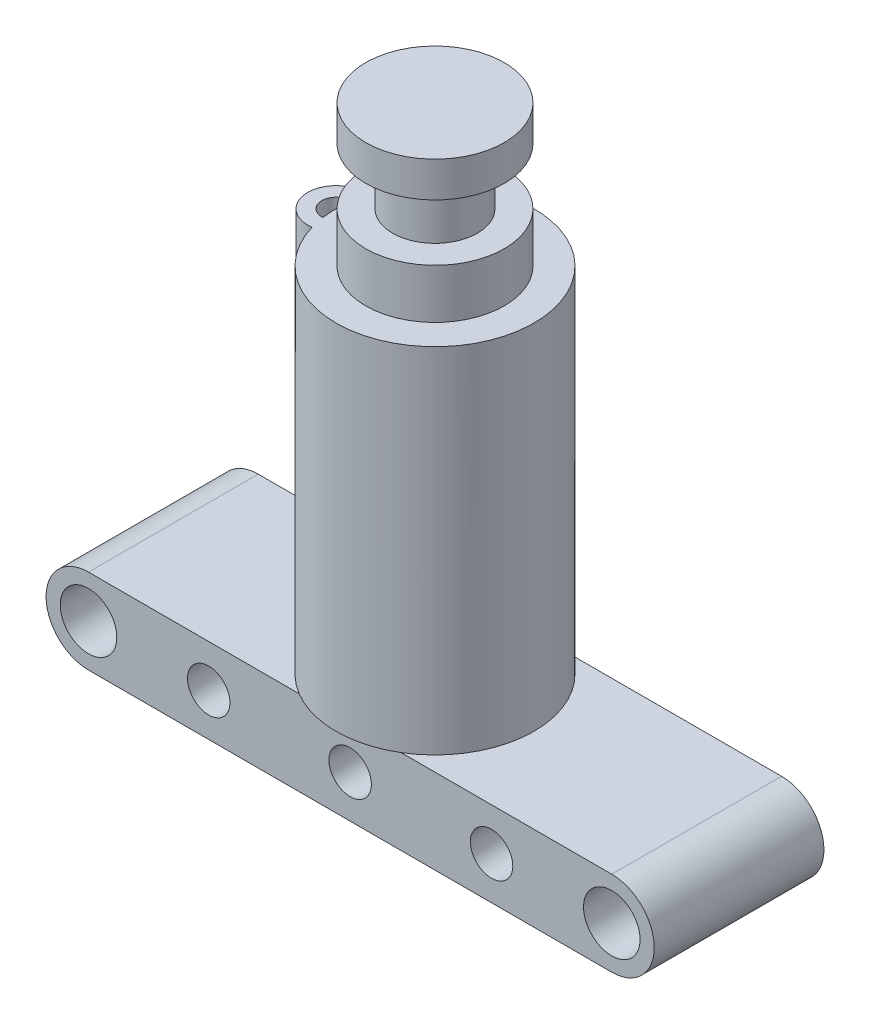
ISO-10303-21;
HEADER;
FILE_DESCRIPTION(('STEP AP214'),'2;1');
FILE_NAME('part.step','',(''),(''),'','','');
FILE_SCHEMA(('AUTOMOTIVE_DESIGN { 1 0 10303 214 1 1 1 1 }'));
ENDSEC;
DATA;
#1=APPLICATION_CONTEXT('core data for automotive mechanical design processes');
#2=APPLICATION_PROTOCOL_DEFINITION('international standard','automotive_design',2000,#1);
#3=PRODUCT_CONTEXT('',#1,'mechanical');
#4=PRODUCT('Part','Part','',(#3));
#5=PRODUCT_RELATED_PRODUCT_CATEGORY('part','',(#4));
#6=PRODUCT_DEFINITION_FORMATION('','',#4);
#7=PRODUCT_DEFINITION_CONTEXT('part definition',#1,'design');
#8=PRODUCT_DEFINITION('design','',#6,#7);
#9=PRODUCT_DEFINITION_SHAPE('','',#8);
#10=(LENGTH_UNIT() NAMED_UNIT(*) SI_UNIT(.MILLI.,.METRE.));
#11=(NAMED_UNIT(*) PLANE_ANGLE_UNIT() SI_UNIT($,.RADIAN.));
#12=(NAMED_UNIT(*) SI_UNIT($,.STERADIAN.) SOLID_ANGLE_UNIT());
#13=UNCERTAINTY_MEASURE_WITH_UNIT(LENGTH_MEASURE(1.E-05),#10,'distance_accuracy_value','');
#14=(GEOMETRIC_REPRESENTATION_CONTEXT(3) GLOBAL_UNCERTAINTY_ASSIGNED_CONTEXT((#13)) GLOBAL_UNIT_ASSIGNED_CONTEXT((#10,
#11,#12)) REPRESENTATION_CONTEXT('',''));
#15=CARTESIAN_POINT('',(0.,0.,0.));
#16=DIRECTION('',(0.,0.,1.));
#17=DIRECTION('',(1.,0.,0.));
#18=AXIS2_PLACEMENT_3D('',#15,#16,#17);
#19=CARTESIAN_POINT('',(18.5,38.,6.));
#20=DIRECTION('',(0.,-1.,0.));
#21=DIRECTION('',(0.,0.,-1.));
#22=AXIS2_PLACEMENT_3D('',#19,#20,#21);
#23=CYLINDRICAL_SURFACE('',#22,4.9);
#24=CARTESIAN_POINT('',(18.5,28.,6.));
#25=DIRECTION('',(0.,1.,0.));
#26=DIRECTION('',(0.,0.,1.));
#27=AXIS2_PLACEMENT_3D('',#24,#25,#26);
#28=CIRCLE('',#27,4.9);
#29=CARTESIAN_POINT('',(18.5,28.,10.9));
#30=VERTEX_POINT('',#29);
#31=EDGE_CURVE('E174',#30,#30,#28,.T.);
#32=ORIENTED_EDGE('',*,*,#31,.T.);
#33=EDGE_LOOP('',(#32));
#34=FACE_BOUND('',#33,.T.);
#35=CARTESIAN_POINT('',(18.5,31.5,6.));
#36=DIRECTION('',(0.,1.,0.));
#37=DIRECTION('',(0.,0.,1.));
#38=AXIS2_PLACEMENT_3D('',#35,#36,#37);
#39=CIRCLE('',#38,4.9);
#40=CARTESIAN_POINT('',(18.5,31.5,10.9));
#41=VERTEX_POINT('',#40);
#42=EDGE_CURVE('E385',#41,#41,#39,.T.);
#43=ORIENTED_EDGE('',*,*,#42,.F.);
#44=EDGE_LOOP('',(#43));
#45=FACE_BOUND('',#44,.T.);
#46=ADVANCED_FACE('F47',(#34,#45),#23,.T.);
#47=CARTESIAN_POINT('',(0.,3.,12.));
#48=DIRECTION('',(0.,-1.,0.));
#49=DIRECTION('',(0.,0.,-1.));
#50=AXIS2_PLACEMENT_3D('',#47,#48,#49);
#51=PLANE('',#50);
#52=CARTESIAN_POINT('',(18.5,3.,6.));
#53=DIRECTION('',(0.,-1.,0.));
#54=DIRECTION('',(0.,0.,-1.));
#55=AXIS2_PLACEMENT_3D('',#52,#53,#54);
#56=CIRCLE('',#55,7.);
#57=CARTESIAN_POINT('',(14.894448724536,3.,0.));
#58=VERTEX_POINT('',#57);
#59=CARTESIAN_POINT('',(14.894448724536,3.,12.));
#60=VERTEX_POINT('',#59);
#61=EDGE_CURVE('E319',#58,#60,#56,.F.);
#62=ORIENTED_EDGE('',*,*,#61,.F.);
#63=DIRECTION('',(-1.,0.,0.));
#64=VECTOR('',#63,1.);
#65=CARTESIAN_POINT('',(0.,3.,0.));
#66=LINE('',#65,#64);
#67=CARTESIAN_POINT('',(0.,3.,0.));
#68=VERTEX_POINT('',#67);
#69=EDGE_CURVE('E301',#58,#68,#66,.T.);
#70=ORIENTED_EDGE('',*,*,#69,.T.);
#71=DIRECTION('',(0.,0.,-1.));
#72=VECTOR('',#71,1.);
#73=CARTESIAN_POINT('',(0.,3.,12.));
#74=LINE('',#73,#72);
#75=CARTESIAN_POINT('',(0.,3.,12.));
#76=VERTEX_POINT('',#75);
#77=EDGE_CURVE('E290',#76,#68,#74,.T.);
#78=ORIENTED_EDGE('',*,*,#77,.F.);
#79=DIRECTION('',(-1.,0.,0.));
#80=VECTOR('',#79,1.);
#81=CARTESIAN_POINT('',(0.,3.,12.));
#82=LINE('',#81,#80);
#83=EDGE_CURVE('E285',#60,#76,#82,.T.);
#84=ORIENTED_EDGE('',*,*,#83,.F.);
#85=EDGE_LOOP('',(#62,#70,#78,#84));
#86=FACE_BOUND('',#85,.T.);
#87=ADVANCED_FACE('F355',(#86),#51,.F.);
#88=CARTESIAN_POINT('',(0.,0.,12.));
#89=DIRECTION('',(0.,0.,1.));
#90=DIRECTION('',(1.,0.,0.));
#91=AXIS2_PLACEMENT_3D('',#88,#89,#90);
#92=PLANE('',#91);
#93=CARTESIAN_POINT('',(8.5,0.,12.));
#94=DIRECTION('',(0.,0.,1.));
#95=DIRECTION('',(1.,0.,0.));
#96=AXIS2_PLACEMENT_3D('',#93,#94,#95);
#97=CIRCLE('',#96,1.5);
#98=CARTESIAN_POINT('',(10.,0.,12.));
#99=VERTEX_POINT('',#98);
#100=EDGE_CURVE('E237',#99,#99,#97,.T.);
#101=ORIENTED_EDGE('',*,*,#100,.F.);
#102=EDGE_LOOP('',(#101));
#103=FACE_BOUND('',#102,.T.);
#104=CARTESIAN_POINT('',(28.5,0.,12.));
#105=DIRECTION('',(0.,0.,1.));
#106=DIRECTION('',(1.,0.,0.));
#107=AXIS2_PLACEMENT_3D('',#104,#105,#106);
#108=CIRCLE('',#107,1.5);
#109=CARTESIAN_POINT('',(30.,0.,12.));
#110=VERTEX_POINT('',#109);
#111=EDGE_CURVE('E238',#110,#110,#108,.T.);
#112=ORIENTED_EDGE('',*,*,#111,.F.);
#113=EDGE_LOOP('',(#112));
#114=FACE_BOUND('',#113,.T.);
#115=CARTESIAN_POINT('',(18.5,0.,12.));
#116=DIRECTION('',(0.,0.,1.));
#117=DIRECTION('',(1.,0.,0.));
#118=AXIS2_PLACEMENT_3D('',#115,#116,#117);
#119=CIRCLE('',#118,1.5);
#120=CARTESIAN_POINT('',(20.,0.,12.));
#121=VERTEX_POINT('',#120);
#122=EDGE_CURVE('E242',#121,#121,#119,.T.);
#123=ORIENTED_EDGE('',*,*,#122,.F.);
#124=EDGE_LOOP('',(#123));
#125=FACE_BOUND('',#124,.T.);
#126=CARTESIAN_POINT('',(0.,0.,12.));
#127=DIRECTION('',(0.,0.,1.));
#128=DIRECTION('',(1.,0.,0.));
#129=AXIS2_PLACEMENT_3D('',#126,#127,#128);
#130=CIRCLE('',#129,2.);
#131=CARTESIAN_POINT('',(2.,0.,12.));
#132=VERTEX_POINT('',#131);
#133=EDGE_CURVE('E266',#132,#132,#130,.T.);
#134=ORIENTED_EDGE('',*,*,#133,.F.);
#135=EDGE_LOOP('',(#134));
#136=FACE_BOUND('',#135,.T.);
#137=CARTESIAN_POINT('',(0.,0.,12.));
#138=DIRECTION('',(0.,0.,1.));
#139=DIRECTION('',(1.,0.,0.));
#140=AXIS2_PLACEMENT_3D('',#137,#138,#139);
#141=CIRCLE('',#140,3.);
#142=CARTESIAN_POINT('',(0.,-3.,12.));
#143=VERTEX_POINT('',#142);
#144=EDGE_CURVE('E274',#76,#143,#141,.T.);
#145=ORIENTED_EDGE('',*,*,#144,.T.);
#146=DIRECTION('',(1.,0.,0.));
#147=VECTOR('',#146,1.);
#148=CARTESIAN_POINT('',(0.,-3.,12.));
#149=LINE('',#148,#147);
#150=CARTESIAN_POINT('',(37.,-3.,12.));
#151=VERTEX_POINT('',#150);
#152=EDGE_CURVE('E278',#143,#151,#149,.T.);
#153=ORIENTED_EDGE('',*,*,#152,.T.);
#154=CARTESIAN_POINT('',(37.,0.,12.));
#155=DIRECTION('',(0.,0.,1.));
#156=DIRECTION('',(1.,0.,0.));
#157=AXIS2_PLACEMENT_3D('',#154,#155,#156);
#158=CIRCLE('',#157,3.);
#159=CARTESIAN_POINT('',(37.,3.,12.));
#160=VERTEX_POINT('',#159);
#161=EDGE_CURVE('E282',#151,#160,#158,.T.);
#162=ORIENTED_EDGE('',*,*,#161,.T.);
#163=CARTESIAN_POINT('',(22.105551275464,3.,12.));
#164=VERTEX_POINT('',#163);
#165=EDGE_CURVE('E286',#160,#164,#82,.T.);
#166=ORIENTED_EDGE('',*,*,#165,.T.);
#167=EDGE_CURVE('E291',#164,#60,#82,.T.);
#168=ORIENTED_EDGE('',*,*,#167,.T.);
#169=ORIENTED_EDGE('',*,*,#83,.T.);
#170=EDGE_LOOP('',(#145,#153,#162,#166,#168,#169));
#171=FACE_BOUND('',#170,.T.);
#172=CARTESIAN_POINT('',(37.,0.,12.));
#173=DIRECTION('',(0.,0.,1.));
#174=DIRECTION('',(1.,0.,0.));
#175=AXIS2_PLACEMENT_3D('',#172,#173,#174);
#176=CIRCLE('',#175,2.);
#177=CARTESIAN_POINT('',(39.,0.,12.));
#178=VERTEX_POINT('',#177);
#179=EDGE_CURVE('E258',#178,#178,#176,.T.);
#180=ORIENTED_EDGE('',*,*,#179,.F.);
#181=EDGE_LOOP('',(#180));
#182=FACE_BOUND('',#181,.T.);
#183=ADVANCED_FACE('F362',(#103,#114,#125,#136,#171,#182),#92,.T.);
#184=CARTESIAN_POINT('',(0.,0.,0.));
#185=DIRECTION('',(0.,0.,1.));
#186=DIRECTION('',(1.,0.,0.));
#187=AXIS2_PLACEMENT_3D('',#184,#185,#186);
#188=PLANE('',#187);
#189=CARTESIAN_POINT('',(8.5,0.,0.));
#190=DIRECTION('',(0.,0.,1.));
#191=DIRECTION('',(1.,0.,0.));
#192=AXIS2_PLACEMENT_3D('',#189,#190,#191);
#193=CIRCLE('',#192,1.5);
#194=CARTESIAN_POINT('',(10.,0.,0.));
#195=VERTEX_POINT('',#194);
#196=EDGE_CURVE('E233',#195,#195,#193,.T.);
#197=ORIENTED_EDGE('',*,*,#196,.T.);
#198=EDGE_LOOP('',(#197));
#199=FACE_BOUND('',#198,.T.);
#200=CARTESIAN_POINT('',(28.5,0.,0.));
#201=DIRECTION('',(0.,0.,1.));
#202=DIRECTION('',(1.,0.,0.));
#203=AXIS2_PLACEMENT_3D('',#200,#201,#202);
#204=CIRCLE('',#203,1.5);
#205=CARTESIAN_POINT('',(30.,0.,0.));
#206=VERTEX_POINT('',#205);
#207=EDGE_CURVE('E243',#206,#206,#204,.T.);
#208=ORIENTED_EDGE('',*,*,#207,.T.);
#209=EDGE_LOOP('',(#208));
#210=FACE_BOUND('',#209,.T.);
#211=CARTESIAN_POINT('',(18.5,0.,0.));
#212=DIRECTION('',(0.,0.,1.));
#213=DIRECTION('',(1.,0.,0.));
#214=AXIS2_PLACEMENT_3D('',#211,#212,#213);
#215=CIRCLE('',#214,1.5);
#216=CARTESIAN_POINT('',(20.,0.,0.));
#217=VERTEX_POINT('',#216);
#218=EDGE_CURVE('E250',#217,#217,#215,.T.);
#219=ORIENTED_EDGE('',*,*,#218,.T.);
#220=EDGE_LOOP('',(#219));
#221=FACE_BOUND('',#220,.T.);
#222=CARTESIAN_POINT('',(0.,0.,0.));
#223=DIRECTION('',(0.,0.,1.));
#224=DIRECTION('',(1.,0.,0.));
#225=AXIS2_PLACEMENT_3D('',#222,#223,#224);
#226=CIRCLE('',#225,3.);
#227=CARTESIAN_POINT('',(0.,-3.,0.));
#228=VERTEX_POINT('',#227);
#229=EDGE_CURVE('E270',#68,#228,#226,.T.);
#230=ORIENTED_EDGE('',*,*,#229,.F.);
#231=ORIENTED_EDGE('',*,*,#69,.F.);
#232=CARTESIAN_POINT('',(22.105551275464,3.,0.));
#233=VERTEX_POINT('',#232);
#234=EDGE_CURVE('E304',#233,#58,#66,.T.);
#235=ORIENTED_EDGE('',*,*,#234,.F.);
#236=CARTESIAN_POINT('',(37.,3.,0.));
#237=VERTEX_POINT('',#236);
#238=EDGE_CURVE('E279',#237,#233,#66,.T.);
#239=ORIENTED_EDGE('',*,*,#238,.F.);
#240=CARTESIAN_POINT('',(37.,0.,0.));
#241=DIRECTION('',(0.,0.,1.));
#242=DIRECTION('',(1.,0.,0.));
#243=AXIS2_PLACEMENT_3D('',#240,#241,#242);
#244=CIRCLE('',#243,3.);
#245=CARTESIAN_POINT('',(37.,-3.,0.));
#246=VERTEX_POINT('',#245);
#247=EDGE_CURVE('E298',#246,#237,#244,.T.);
#248=ORIENTED_EDGE('',*,*,#247,.F.);
#249=DIRECTION('',(1.,0.,0.));
#250=VECTOR('',#249,1.);
#251=CARTESIAN_POINT('',(0.,-3.,0.));
#252=LINE('',#251,#250);
#253=EDGE_CURVE('E295',#228,#246,#252,.T.);
#254=ORIENTED_EDGE('',*,*,#253,.F.);
#255=EDGE_LOOP('',(#230,#231,#235,#239,#248,#254));
#256=FACE_BOUND('',#255,.T.);
#257=CARTESIAN_POINT('',(0.,0.,0.));
#258=DIRECTION('',(0.,0.,1.));
#259=DIRECTION('',(1.,0.,0.));
#260=AXIS2_PLACEMENT_3D('',#257,#258,#259);
#261=CIRCLE('',#260,2.);
#262=CARTESIAN_POINT('',(2.,0.,0.));
#263=VERTEX_POINT('',#262);
#264=EDGE_CURVE('E262',#263,#263,#261,.T.);
#265=ORIENTED_EDGE('',*,*,#264,.T.);
#266=EDGE_LOOP('',(#265));
#267=FACE_BOUND('',#266,.T.);
#268=CARTESIAN_POINT('',(37.,0.,0.));
#269=DIRECTION('',(0.,0.,1.));
#270=DIRECTION('',(1.,0.,0.));
#271=AXIS2_PLACEMENT_3D('',#268,#269,#270);
#272=CIRCLE('',#271,2.);
#273=CARTESIAN_POINT('',(39.,0.,0.));
#274=VERTEX_POINT('',#273);
#275=EDGE_CURVE('E254',#274,#274,#272,.T.);
#276=ORIENTED_EDGE('',*,*,#275,.T.);
#277=EDGE_LOOP('',(#276));
#278=FACE_BOUND('',#277,.T.);
#279=ADVANCED_FACE('F659',(#199,#210,#221,#256,#267,#278),#188,.F.);
#280=CARTESIAN_POINT('',(0.,0.,12.));
#281=DIRECTION('',(0.,0.,-1.));
#282=DIRECTION('',(-1.,0.,0.));
#283=AXIS2_PLACEMENT_3D('',#280,#281,#282);
#284=CYLINDRICAL_SURFACE('',#283,3.);
#285=ORIENTED_EDGE('',*,*,#229,.T.);
#286=DIRECTION('',(0.,0.,-1.));
#287=VECTOR('',#286,1.);
#288=CARTESIAN_POINT('',(0.,-3.,12.));
#289=LINE('',#288,#287);
#290=EDGE_CURVE('E316',#143,#228,#289,.T.);
#291=ORIENTED_EDGE('',*,*,#290,.F.);
#292=ORIENTED_EDGE('',*,*,#144,.F.);
#293=ORIENTED_EDGE('',*,*,#77,.T.);
#294=EDGE_LOOP('',(#285,#291,#292,#293));
#295=FACE_BOUND('',#294,.T.);
#296=ADVANCED_FACE('F49',(#295),#284,.T.);
#297=CARTESIAN_POINT('',(0.,-3.,12.));
#298=DIRECTION('',(0.,1.,0.));
#299=DIRECTION('',(0.,0.,1.));
#300=AXIS2_PLACEMENT_3D('',#297,#298,#299);
#301=PLANE('',#300);
#302=ORIENTED_EDGE('',*,*,#253,.T.);
#303=DIRECTION('',(0.,0.,-1.));
#304=VECTOR('',#303,1.);
#305=CARTESIAN_POINT('',(37.,-3.,12.));
#306=LINE('',#305,#304);
#307=EDGE_CURVE('E312',#151,#246,#306,.T.);
#308=ORIENTED_EDGE('',*,*,#307,.F.);
#309=ORIENTED_EDGE('',*,*,#152,.F.);
#310=ORIENTED_EDGE('',*,*,#290,.T.);
#311=EDGE_LOOP('',(#302,#308,#309,#310));
#312=FACE_BOUND('',#311,.T.);
#313=ADVANCED_FACE('F641',(#312),#301,.F.);
#314=CARTESIAN_POINT('',(37.,0.,12.));
#315=DIRECTION('',(0.,0.,-1.));
#316=DIRECTION('',(-1.,0.,0.));
#317=AXIS2_PLACEMENT_3D('',#314,#315,#316);
#318=CYLINDRICAL_SURFACE('',#317,3.);
#319=ORIENTED_EDGE('',*,*,#247,.T.);
#320=DIRECTION('',(0.,0.,-1.));
#321=VECTOR('',#320,1.);
#322=CARTESIAN_POINT('',(37.,3.,12.));
#323=LINE('',#322,#321);
#324=EDGE_CURVE('E308',#160,#237,#323,.T.);
#325=ORIENTED_EDGE('',*,*,#324,.F.);
#326=ORIENTED_EDGE('',*,*,#161,.F.);
#327=ORIENTED_EDGE('',*,*,#307,.T.);
#328=EDGE_LOOP('',(#319,#325,#326,#327));
#329=FACE_BOUND('',#328,.T.);
#330=ADVANCED_FACE('F632',(#329),#318,.T.);
#331=CARTESIAN_POINT('',(18.5,3.,6.));
#332=DIRECTION('',(0.,1.,0.));
#333=DIRECTION('',(0.,0.,1.));
#334=AXIS2_PLACEMENT_3D('',#331,#332,#333);
#335=CIRCLE('',#334,7.);
#336=EDGE_CURVE('E228',#164,#233,#335,.T.);
#337=ORIENTED_EDGE('',*,*,#336,.F.);
#338=ORIENTED_EDGE('',*,*,#165,.F.);
#339=ORIENTED_EDGE('',*,*,#324,.T.);
#340=ORIENTED_EDGE('',*,*,#238,.T.);
#341=EDGE_LOOP('',(#337,#338,#339,#340));
#342=FACE_BOUND('',#341,.T.);
#343=ADVANCED_FACE('F365',(#342),#51,.F.);
#344=CARTESIAN_POINT('',(0.,0.,12.));
#345=DIRECTION('',(0.,0.,-1.));
#346=DIRECTION('',(-1.,0.,0.));
#347=AXIS2_PLACEMENT_3D('',#344,#345,#346);
#348=CYLINDRICAL_SURFACE('',#347,2.);
#349=ORIENTED_EDGE('',*,*,#133,.T.);
#350=EDGE_LOOP('',(#349));
#351=FACE_BOUND('',#350,.T.);
#352=ORIENTED_EDGE('',*,*,#264,.F.);
#353=EDGE_LOOP('',(#352));
#354=FACE_BOUND('',#353,.T.);
#355=ADVANCED_FACE('F613',(#351,#354),#348,.F.);
#356=CARTESIAN_POINT('',(37.,0.,12.));
#357=DIRECTION('',(0.,0.,-1.));
#358=DIRECTION('',(-1.,0.,0.));
#359=AXIS2_PLACEMENT_3D('',#356,#357,#358);
#360=CYLINDRICAL_SURFACE('',#359,2.);
#361=ORIENTED_EDGE('',*,*,#179,.T.);
#362=EDGE_LOOP('',(#361));
#363=FACE_BOUND('',#362,.T.);
#364=ORIENTED_EDGE('',*,*,#275,.F.);
#365=EDGE_LOOP('',(#364));
#366=FACE_BOUND('',#365,.T.);
#367=ADVANCED_FACE('F603',(#363,#366),#360,.F.);
#368=CARTESIAN_POINT('',(18.5,0.,0.));
#369=DIRECTION('',(0.,0.,1.));
#370=DIRECTION('',(1.,0.,0.));
#371=AXIS2_PLACEMENT_3D('',#368,#369,#370);
#372=CYLINDRICAL_SURFACE('',#371,1.5);
#373=ORIENTED_EDGE('',*,*,#218,.F.);
#374=EDGE_LOOP('',(#373));
#375=FACE_BOUND('',#374,.T.);
#376=ORIENTED_EDGE('',*,*,#122,.T.);
#377=EDGE_LOOP('',(#376));
#378=FACE_BOUND('',#377,.T.);
#379=ADVANCED_FACE('F586',(#375,#378),#372,.F.);
#380=CARTESIAN_POINT('',(28.5,0.,0.));
#381=DIRECTION('',(0.,0.,1.));
#382=DIRECTION('',(1.,0.,0.));
#383=AXIS2_PLACEMENT_3D('',#380,#381,#382);
#384=CYLINDRICAL_SURFACE('',#383,1.5);
#385=ORIENTED_EDGE('',*,*,#207,.F.);
#386=EDGE_LOOP('',(#385));
#387=FACE_BOUND('',#386,.T.);
#388=ORIENTED_EDGE('',*,*,#111,.T.);
#389=EDGE_LOOP('',(#388));
#390=FACE_BOUND('',#389,.T.);
#391=ADVANCED_FACE('F581',(#387,#390),#384,.F.);
#392=CARTESIAN_POINT('',(8.5,0.,0.));
#393=DIRECTION('',(0.,0.,1.));
#394=DIRECTION('',(1.,0.,0.));
#395=AXIS2_PLACEMENT_3D('',#392,#393,#394);
#396=CYLINDRICAL_SURFACE('',#395,1.5);
#397=ORIENTED_EDGE('',*,*,#196,.F.);
#398=EDGE_LOOP('',(#397));
#399=FACE_BOUND('',#398,.T.);
#400=ORIENTED_EDGE('',*,*,#100,.T.);
#401=EDGE_LOOP('',(#400));
#402=FACE_BOUND('',#401,.T.);
#403=ADVANCED_FACE('F566',(#399,#402),#396,.F.);
#404=CARTESIAN_POINT('',(18.5,3.,6.));
#405=DIRECTION('',(0.,1.,0.));
#406=DIRECTION('',(0.,0.,1.));
#407=AXIS2_PLACEMENT_3D('',#404,#405,#406);
#408=PLANE('',#407);
#409=EDGE_CURVE('E232',#233,#58,#335,.T.);
#410=ORIENTED_EDGE('',*,*,#409,.F.);
#411=ORIENTED_EDGE('',*,*,#234,.T.);
#412=EDGE_LOOP('',(#410,#411));
#413=FACE_BOUND('',#412,.T.);
#414=ADVANCED_FACE('F349',(#413),#408,.F.);
#415=CARTESIAN_POINT('',(18.5,28.,6.));
#416=DIRECTION('',(0.,-1.,0.));
#417=DIRECTION('',(0.,0.,-1.));
#418=AXIS2_PLACEMENT_3D('',#415,#416,#417);
#419=CYLINDRICAL_SURFACE('',#418,7.);
#420=DIRECTION('',(0.,1.,0.));
#421=VECTOR('',#420,1.);
#422=CARTESIAN_POINT('',(11.7857142857143,12.,7.97948663722157));
#423=LINE('',#422,#421);
#424=CARTESIAN_POINT('',(11.7857142857143,12.,7.97948663722157));
#425=VERTEX_POINT('',#424);
#426=CARTESIAN_POINT('',(11.7857142857143,16.,7.97948663722157));
#427=VERTEX_POINT('',#426);
#428=EDGE_CURVE('E68',#425,#427,#423,.T.);
#429=ORIENTED_EDGE('',*,*,#428,.F.);
#430=CARTESIAN_POINT('',(18.5,12.,6.));
#431=DIRECTION('',(0.,1.,0.));
#432=DIRECTION('',(0.,0.,-1.));
#433=AXIS2_PLACEMENT_3D('',#430,#431,#432);
#434=CIRCLE('',#433,7.);
#435=CARTESIAN_POINT('',(11.5714285714286,12.,6.99744571741207));
#436=VERTEX_POINT('',#435);
#437=EDGE_CURVE('E63',#436,#425,#434,.T.);
#438=ORIENTED_EDGE('',*,*,#437,.F.);
#439=DIRECTION('',(0.,1.,0.));
#440=VECTOR('',#439,1.);
#441=CARTESIAN_POINT('',(11.5714285714286,12.,6.99744571741207));
#442=LINE('',#441,#440);
#443=CARTESIAN_POINT('',(11.5714285714286,16.,6.99744571741207));
#444=VERTEX_POINT('',#443);
#445=EDGE_CURVE('E145',#436,#444,#442,.T.);
#446=ORIENTED_EDGE('',*,*,#445,.T.);
#447=CARTESIAN_POINT('',(18.5,16.,6.));
#448=DIRECTION('',(0.,1.,0.));
#449=DIRECTION('',(0.,0.,-1.));
#450=AXIS2_PLACEMENT_3D('',#447,#448,#449);
#451=CIRCLE('',#450,7.);
#452=EDGE_CURVE('E149',#444,#427,#451,.T.);
#453=ORIENTED_EDGE('',*,*,#452,.T.);
#454=EDGE_LOOP('',(#429,#438,#446,#453));
#455=FACE_BOUND('',#454,.T.);
#456=DIRECTION('',(0.,1.,0.));
#457=VECTOR('',#456,1.);
#458=CARTESIAN_POINT('',(11.5714285714286,12.,5.00255428258793));
#459=LINE('',#458,#457);
#460=CARTESIAN_POINT('',(11.5714285714286,12.,5.00255428258793));
#461=VERTEX_POINT('',#460);
#462=CARTESIAN_POINT('',(11.5714285714286,16.,5.00255428258793));
#463=VERTEX_POINT('',#462);
#464=EDGE_CURVE('E168',#461,#463,#459,.T.);
#465=ORIENTED_EDGE('',*,*,#464,.F.);
#466=CARTESIAN_POINT('',(18.5,12.,6.));
#467=DIRECTION('',(0.,1.,0.));
#468=DIRECTION('',(0.,0.,-1.));
#469=AXIS2_PLACEMENT_3D('',#466,#467,#468);
#470=CIRCLE('',#469,7.);
#471=CARTESIAN_POINT('',(11.7857142857143,12.,4.02051336277843));
#472=VERTEX_POINT('',#471);
#473=EDGE_CURVE('E177',#472,#461,#470,.T.);
#474=ORIENTED_EDGE('',*,*,#473,.F.);
#475=DIRECTION('',(0.,1.,0.));
#476=VECTOR('',#475,1.);
#477=CARTESIAN_POINT('',(11.7857142857143,12.,4.02051336277843));
#478=LINE('',#477,#476);
#479=CARTESIAN_POINT('',(11.7857142857143,16.,4.02051336277843));
#480=VERTEX_POINT('',#479);
#481=EDGE_CURVE('E188',#472,#480,#478,.T.);
#482=ORIENTED_EDGE('',*,*,#481,.T.);
#483=CARTESIAN_POINT('',(18.5,16.,6.));
#484=DIRECTION('',(0.,1.,0.));
#485=DIRECTION('',(0.,0.,-1.));
#486=AXIS2_PLACEMENT_3D('',#483,#484,#485);
#487=CIRCLE('',#486,7.);
#488=EDGE_CURVE('E182',#480,#463,#487,.T.);
#489=ORIENTED_EDGE('',*,*,#488,.T.);
#490=EDGE_LOOP('',(#465,#474,#482,#489));
#491=FACE_BOUND('',#490,.T.);
#492=CARTESIAN_POINT('',(18.5,24.,6.));
#493=DIRECTION('',(0.,1.,0.));
#494=DIRECTION('',(0.,0.,1.));
#495=AXIS2_PLACEMENT_3D('',#492,#493,#494);
#496=CIRCLE('',#495,7.);
#497=CARTESIAN_POINT('',(11.7857142857143,24.,4.02051336277843));
#498=VERTEX_POINT('',#497);
#499=CARTESIAN_POINT('',(11.5714285714286,24.,5.00255428258793));
#500=VERTEX_POINT('',#499);
#501=EDGE_CURVE('E12',#498,#500,#496,.T.);
#502=ORIENTED_EDGE('',*,*,#501,.F.);
#503=DIRECTION('',(0.,1.,0.));
#504=VECTOR('',#503,1.);
#505=CARTESIAN_POINT('',(11.7857142857143,26.,4.02051336277843));
#506=LINE('',#505,#504);
#507=CARTESIAN_POINT('',(11.7857142857143,28.,4.02051336277842));
#508=VERTEX_POINT('',#507);
#509=EDGE_CURVE('E219',#498,#508,#506,.T.);
#510=ORIENTED_EDGE('',*,*,#509,.T.);
#511=CARTESIAN_POINT('',(18.5,28.,6.));
#512=DIRECTION('',(0.,1.,0.));
#513=DIRECTION('',(0.,0.,1.));
#514=AXIS2_PLACEMENT_3D('',#511,#512,#513);
#515=CIRCLE('',#514,7.);
#516=CARTESIAN_POINT('',(11.7857142857143,28.,7.97948663722157));
#517=VERTEX_POINT('',#516);
#518=EDGE_CURVE('E223',#517,#508,#515,.T.);
#519=ORIENTED_EDGE('',*,*,#518,.F.);
#520=DIRECTION('',(0.,1.,0.));
#521=VECTOR('',#520,1.);
#522=CARTESIAN_POINT('',(11.7857142857143,26.,7.97948663722157));
#523=LINE('',#522,#521);
#524=CARTESIAN_POINT('',(11.7857142857143,24.,7.97948663722157));
#525=VERTEX_POINT('',#524);
#526=EDGE_CURVE('E216',#517,#525,#523,.F.);
#527=ORIENTED_EDGE('',*,*,#526,.T.);
#528=CARTESIAN_POINT('',(11.5714285714286,24.,6.99744571741207));
#529=VERTEX_POINT('',#528);
#530=EDGE_CURVE('E51',#529,#525,#496,.T.);
#531=ORIENTED_EDGE('',*,*,#530,.F.);
#532=DIRECTION('',(0.,1.,0.));
#533=VECTOR('',#532,1.);
#534=CARTESIAN_POINT('',(11.5714285714286,26.,6.99744571741207));
#535=LINE('',#534,#533);
#536=CARTESIAN_POINT('',(11.5714285714286,28.,6.99744571741207));
#537=VERTEX_POINT('',#536);
#538=EDGE_CURVE('E205',#537,#529,#535,.F.);
#539=ORIENTED_EDGE('',*,*,#538,.F.);
#540=CARTESIAN_POINT('',(11.5714285714286,28.,5.00255428258793));
#541=VERTEX_POINT('',#540);
#542=EDGE_CURVE('E227',#541,#537,#515,.T.);
#543=ORIENTED_EDGE('',*,*,#542,.F.);
#544=DIRECTION('',(0.,1.,0.));
#545=VECTOR('',#544,1.);
#546=CARTESIAN_POINT('',(11.5714285714286,26.,5.00255428258793));
#547=LINE('',#546,#545);
#548=EDGE_CURVE('E212',#500,#541,#547,.T.);
#549=ORIENTED_EDGE('',*,*,#548,.F.);
#550=EDGE_LOOP('',(#502,#510,#519,#527,#531,#539,#543,#549));
#551=FACE_BOUND('',#550,.T.);
#552=ORIENTED_EDGE('',*,*,#336,.T.);
#553=ORIENTED_EDGE('',*,*,#409,.T.);
#554=ORIENTED_EDGE('',*,*,#61,.T.);
#555=EDGE_CURVE('E222',#60,#164,#335,.T.);
#556=ORIENTED_EDGE('',*,*,#555,.T.);
#557=EDGE_LOOP('',(#552,#553,#554,#556));
#558=FACE_BOUND('',#557,.T.);
#559=ADVANCED_FACE('F147',(#455,#491,#551,#558),#419,.T.);
#560=CARTESIAN_POINT('',(18.5,28.,6.));
#561=DIRECTION('',(0.,1.,0.));
#562=DIRECTION('',(0.,0.,1.));
#563=AXIS2_PLACEMENT_3D('',#560,#561,#562);
#564=PLANE('',#563);
#565=ORIENTED_EDGE('',*,*,#31,.F.);
#566=EDGE_LOOP('',(#565));
#567=FACE_BOUND('',#566,.T.);
#568=CARTESIAN_POINT('',(11.5,28.,6.));
#569=DIRECTION('',(0.,1.,0.));
#570=DIRECTION('',(0.,0.,1.));
#571=AXIS2_PLACEMENT_3D('',#568,#569,#570);
#572=CIRCLE('',#571,1.);
#573=EDGE_CURVE('E154',#541,#537,#572,.T.);
#574=ORIENTED_EDGE('',*,*,#573,.F.);
#575=ORIENTED_EDGE('',*,*,#542,.T.);
#576=EDGE_LOOP('',(#574,#575));
#577=FACE_BOUND('',#576,.T.);
#578=ORIENTED_EDGE('',*,*,#518,.T.);
#579=CARTESIAN_POINT('',(11.5,28.,6.));
#580=DIRECTION('',(0.,1.,0.));
#581=DIRECTION('',(0.,0.,1.));
#582=AXIS2_PLACEMENT_3D('',#579,#580,#581);
#583=CIRCLE('',#582,2.);
#584=EDGE_CURVE('E197',#508,#517,#583,.T.);
#585=ORIENTED_EDGE('',*,*,#584,.T.);
#586=EDGE_LOOP('',(#578,#585));
#587=FACE_BOUND('',#586,.T.);
#588=ADVANCED_FACE('F338',(#567,#577,#587),#564,.T.);
#589=ORIENTED_EDGE('',*,*,#167,.F.);
#590=ORIENTED_EDGE('',*,*,#555,.F.);
#591=EDGE_LOOP('',(#589,#590));
#592=FACE_BOUND('',#591,.T.);
#593=ADVANCED_FACE('F340',(#592),#408,.F.);
#594=CARTESIAN_POINT('',(11.5,24.,6.));
#595=DIRECTION('',(0.,1.,0.));
#596=DIRECTION('',(0.,0.,1.));
#597=AXIS2_PLACEMENT_3D('',#594,#595,#596);
#598=CYLINDRICAL_SURFACE('',#597,2.);
#599=ORIENTED_EDGE('',*,*,#509,.F.);
#600=CARTESIAN_POINT('',(11.5,24.,6.));
#601=DIRECTION('',(0.,1.,0.));
#602=DIRECTION('',(0.,0.,1.));
#603=AXIS2_PLACEMENT_3D('',#600,#601,#602);
#604=CIRCLE('',#603,2.);
#605=EDGE_CURVE('E201',#498,#525,#604,.T.);
#606=ORIENTED_EDGE('',*,*,#605,.T.);
#607=ORIENTED_EDGE('',*,*,#526,.F.);
#608=ORIENTED_EDGE('',*,*,#584,.F.);
#609=EDGE_LOOP('',(#599,#606,#607,#608));
#610=FACE_BOUND('',#609,.T.);
#611=ADVANCED_FACE('F335',(#610),#598,.T.);
#612=CARTESIAN_POINT('',(11.5,24.,6.));
#613=DIRECTION('',(0.,1.,0.));
#614=DIRECTION('',(0.,0.,1.));
#615=AXIS2_PLACEMENT_3D('',#612,#613,#614);
#616=CYLINDRICAL_SURFACE('',#615,1.);
#617=CARTESIAN_POINT('',(11.5,24.,6.));
#618=DIRECTION('',(0.,1.,0.));
#619=DIRECTION('',(0.,0.,1.));
#620=AXIS2_PLACEMENT_3D('',#617,#618,#619);
#621=CIRCLE('',#620,1.);
#622=EDGE_CURVE('E193',#500,#529,#621,.T.);
#623=ORIENTED_EDGE('',*,*,#622,.F.);
#624=ORIENTED_EDGE('',*,*,#548,.T.);
#625=ORIENTED_EDGE('',*,*,#573,.T.);
#626=ORIENTED_EDGE('',*,*,#538,.T.);
#627=EDGE_LOOP('',(#623,#624,#625,#626));
#628=FACE_BOUND('',#627,.T.);
#629=ADVANCED_FACE('F422',(#628),#616,.F.);
#630=CARTESIAN_POINT('',(11.5,24.,6.));
#631=DIRECTION('',(0.,1.,0.));
#632=DIRECTION('',(0.,0.,1.));
#633=AXIS2_PLACEMENT_3D('',#630,#631,#632);
#634=PLANE('',#633);
#635=ORIENTED_EDGE('',*,*,#605,.F.);
#636=ORIENTED_EDGE('',*,*,#501,.T.);
#637=ORIENTED_EDGE('',*,*,#622,.T.);
#638=ORIENTED_EDGE('',*,*,#530,.T.);
#639=EDGE_LOOP('',(#635,#636,#637,#638));
#640=FACE_BOUND('',#639,.T.);
#641=ADVANCED_FACE('F329',(#640),#634,.F.);
#642=CARTESIAN_POINT('',(11.5,12.,6.));
#643=DIRECTION('',(0.,1.,0.));
#644=DIRECTION('',(0.,0.,1.));
#645=AXIS2_PLACEMENT_3D('',#642,#643,#644);
#646=CYLINDRICAL_SURFACE('',#645,1.);
#647=CARTESIAN_POINT('',(11.5,16.,6.));
#648=DIRECTION('',(0.,1.,0.));
#649=DIRECTION('',(0.,0.,-1.));
#650=AXIS2_PLACEMENT_3D('',#647,#648,#649);
#651=CIRCLE('',#650,1.);
#652=EDGE_CURVE('E161',#463,#444,#651,.T.);
#653=ORIENTED_EDGE('',*,*,#652,.T.);
#654=ORIENTED_EDGE('',*,*,#445,.F.);
#655=CARTESIAN_POINT('',(11.5,12.,6.));
#656=DIRECTION('',(0.,1.,0.));
#657=DIRECTION('',(0.,0.,-1.));
#658=AXIS2_PLACEMENT_3D('',#655,#656,#657);
#659=CIRCLE('',#658,1.);
#660=EDGE_CURVE('E185',#461,#436,#659,.T.);
#661=ORIENTED_EDGE('',*,*,#660,.F.);
#662=ORIENTED_EDGE('',*,*,#464,.T.);
#663=EDGE_LOOP('',(#653,#654,#661,#662));
#664=FACE_BOUND('',#663,.T.);
#665=ADVANCED_FACE('F167',(#664),#646,.F.);
#666=CARTESIAN_POINT('',(11.5,12.,6.));
#667=DIRECTION('',(0.,1.,0.));
#668=DIRECTION('',(0.,0.,1.));
#669=AXIS2_PLACEMENT_3D('',#666,#667,#668);
#670=CYLINDRICAL_SURFACE('',#669,2.);
#671=CARTESIAN_POINT('',(11.5,16.,6.));
#672=DIRECTION('',(0.,-1.,0.));
#673=DIRECTION('',(0.,0.,-1.));
#674=AXIS2_PLACEMENT_3D('',#671,#672,#673);
#675=CIRCLE('',#674,2.);
#676=EDGE_CURVE('E163',#427,#480,#675,.T.);
#677=ORIENTED_EDGE('',*,*,#676,.T.);
#678=ORIENTED_EDGE('',*,*,#481,.F.);
#679=CARTESIAN_POINT('',(11.5,12.,6.));
#680=DIRECTION('',(0.,-1.,0.));
#681=DIRECTION('',(0.,0.,-1.));
#682=AXIS2_PLACEMENT_3D('',#679,#680,#681);
#683=CIRCLE('',#682,2.);
#684=EDGE_CURVE('E402',#425,#472,#683,.T.);
#685=ORIENTED_EDGE('',*,*,#684,.F.);
#686=ORIENTED_EDGE('',*,*,#428,.T.);
#687=EDGE_LOOP('',(#677,#678,#685,#686));
#688=FACE_BOUND('',#687,.T.);
#689=ADVANCED_FACE('F412',(#688),#670,.T.);
#690=CARTESIAN_POINT('',(15.,12.,6.));
#691=DIRECTION('',(0.,-1.,0.));
#692=DIRECTION('',(0.,0.,-1.));
#693=AXIS2_PLACEMENT_3D('',#690,#691,#692);
#694=PLANE('',#693);
#695=ORIENTED_EDGE('',*,*,#660,.T.);
#696=ORIENTED_EDGE('',*,*,#437,.T.);
#697=ORIENTED_EDGE('',*,*,#684,.T.);
#698=ORIENTED_EDGE('',*,*,#473,.T.);
#699=EDGE_LOOP('',(#695,#696,#697,#698));
#700=FACE_BOUND('',#699,.T.);
#701=ADVANCED_FACE('F410',(#700),#694,.T.);
#702=CARTESIAN_POINT('',(15.,16.,6.));
#703=DIRECTION('',(0.,-1.,0.));
#704=DIRECTION('',(0.,0.,-1.));
#705=AXIS2_PLACEMENT_3D('',#702,#703,#704);
#706=PLANE('',#705);
#707=ORIENTED_EDGE('',*,*,#652,.F.);
#708=ORIENTED_EDGE('',*,*,#488,.F.);
#709=ORIENTED_EDGE('',*,*,#676,.F.);
#710=ORIENTED_EDGE('',*,*,#452,.F.);
#711=EDGE_LOOP('',(#707,#708,#709,#710));
#712=FACE_BOUND('',#711,.T.);
#713=ADVANCED_FACE('F159',(#712),#706,.F.);
#714=CARTESIAN_POINT('',(18.5,31.5,6.));
#715=DIRECTION('',(0.,1.,0.));
#716=DIRECTION('',(0.,0.,1.));
#717=AXIS2_PLACEMENT_3D('',#714,#715,#716);
#718=PLANE('',#717);
#719=CARTESIAN_POINT('',(18.5,31.5,6.));
#720=DIRECTION('',(0.,1.,0.));
#721=DIRECTION('',(0.,0.,1.));
#722=AXIS2_PLACEMENT_3D('',#719,#720,#721);
#723=CIRCLE('',#722,3.);
#724=CARTESIAN_POINT('',(18.5,31.5,9.));
#725=VERTEX_POINT('',#724);
#726=EDGE_CURVE('E386',#725,#725,#723,.T.);
#727=ORIENTED_EDGE('',*,*,#726,.F.);
#728=EDGE_LOOP('',(#727));
#729=FACE_BOUND('',#728,.T.);
#730=ORIENTED_EDGE('',*,*,#42,.T.);
#731=EDGE_LOOP('',(#730));
#732=FACE_BOUND('',#731,.T.);
#733=ADVANCED_FACE('F468',(#729,#732),#718,.T.);
#734=CARTESIAN_POINT('',(18.5,35.5,6.));
#735=DIRECTION('',(0.,1.,0.));
#736=DIRECTION('',(0.,0.,1.));
#737=AXIS2_PLACEMENT_3D('',#734,#735,#736);
#738=PLANE('',#737);
#739=CARTESIAN_POINT('',(18.5,35.5,6.));
#740=DIRECTION('',(0.,1.,0.));
#741=DIRECTION('',(0.,0.,1.));
#742=AXIS2_PLACEMENT_3D('',#739,#740,#741);
#743=CIRCLE('',#742,3.);
#744=CARTESIAN_POINT('',(18.5,35.5,9.));
#745=VERTEX_POINT('',#744);
#746=EDGE_CURVE('E393',#745,#745,#743,.T.);
#747=ORIENTED_EDGE('',*,*,#746,.T.);
#748=EDGE_LOOP('',(#747));
#749=FACE_BOUND('',#748,.T.);
#750=CARTESIAN_POINT('',(18.5,35.5,6.));
#751=DIRECTION('',(0.,1.,0.));
#752=DIRECTION('',(0.,0.,1.));
#753=AXIS2_PLACEMENT_3D('',#750,#751,#752);
#754=CIRCLE('',#753,4.9);
#755=CARTESIAN_POINT('',(18.5,35.5,10.9));
#756=VERTEX_POINT('',#755);
#757=EDGE_CURVE('E381',#756,#756,#754,.T.);
#758=ORIENTED_EDGE('',*,*,#757,.F.);
#759=EDGE_LOOP('',(#758));
#760=FACE_BOUND('',#759,.T.);
#761=ADVANCED_FACE('F498',(#749,#760),#738,.F.);
#762=CARTESIAN_POINT('',(18.5,31.5,6.));
#763=DIRECTION('',(0.,1.,0.));
#764=DIRECTION('',(0.,0.,1.));
#765=AXIS2_PLACEMENT_3D('',#762,#763,#764);
#766=CYLINDRICAL_SURFACE('',#765,3.);
#767=ORIENTED_EDGE('',*,*,#726,.T.);
#768=EDGE_LOOP('',(#767));
#769=FACE_BOUND('',#768,.T.);
#770=ORIENTED_EDGE('',*,*,#746,.F.);
#771=EDGE_LOOP('',(#770));
#772=FACE_BOUND('',#771,.T.);
#773=ADVANCED_FACE('F376',(#769,#772),#766,.T.);
#774=CARTESIAN_POINT('',(18.5,38.,6.));
#775=DIRECTION('',(0.,1.,0.));
#776=DIRECTION('',(0.,0.,1.));
#777=AXIS2_PLACEMENT_3D('',#774,#775,#776);
#778=PLANE('',#777);
#779=CARTESIAN_POINT('',(18.5,38.,6.));
#780=DIRECTION('',(0.,1.,0.));
#781=DIRECTION('',(0.,0.,1.));
#782=AXIS2_PLACEMENT_3D('',#779,#780,#781);
#783=CIRCLE('',#782,4.9);
#784=CARTESIAN_POINT('',(18.5,38.,10.9));
#785=VERTEX_POINT('',#784);
#786=EDGE_CURVE('E170',#785,#785,#783,.T.);
#787=ORIENTED_EDGE('',*,*,#786,.T.);
#788=EDGE_LOOP('',(#787));
#789=FACE_BOUND('',#788,.T.);
#790=ADVANCED_FACE('F371',(#789),#778,.T.);
#791=ORIENTED_EDGE('',*,*,#757,.T.);
#792=EDGE_LOOP('',(#791));
#793=FACE_BOUND('',#792,.T.);
#794=ORIENTED_EDGE('',*,*,#786,.F.);
#795=EDGE_LOOP('',(#794));
#796=FACE_BOUND('',#795,.T.);
#797=ADVANCED_FACE('F358',(#793,#796),#23,.T.);
#798=CLOSED_SHELL('',(#46,#87,#183,#279,#296,#313,#330,#343,#355,#367,#379,#391,#403,#414,#559,
#588,#593,#611,#629,#641,#665,#689,#701,#713,#733,#761,#773,#790,#797));
#799=MANIFOLD_SOLID_BREP('B2',#798);
#800=ADVANCED_BREP_SHAPE_REPRESENTATION('',(#18,#799),#14);
#801=SHAPE_DEFINITION_REPRESENTATION(#9,#800);
ENDSEC;
END-ISO-10303-21;
